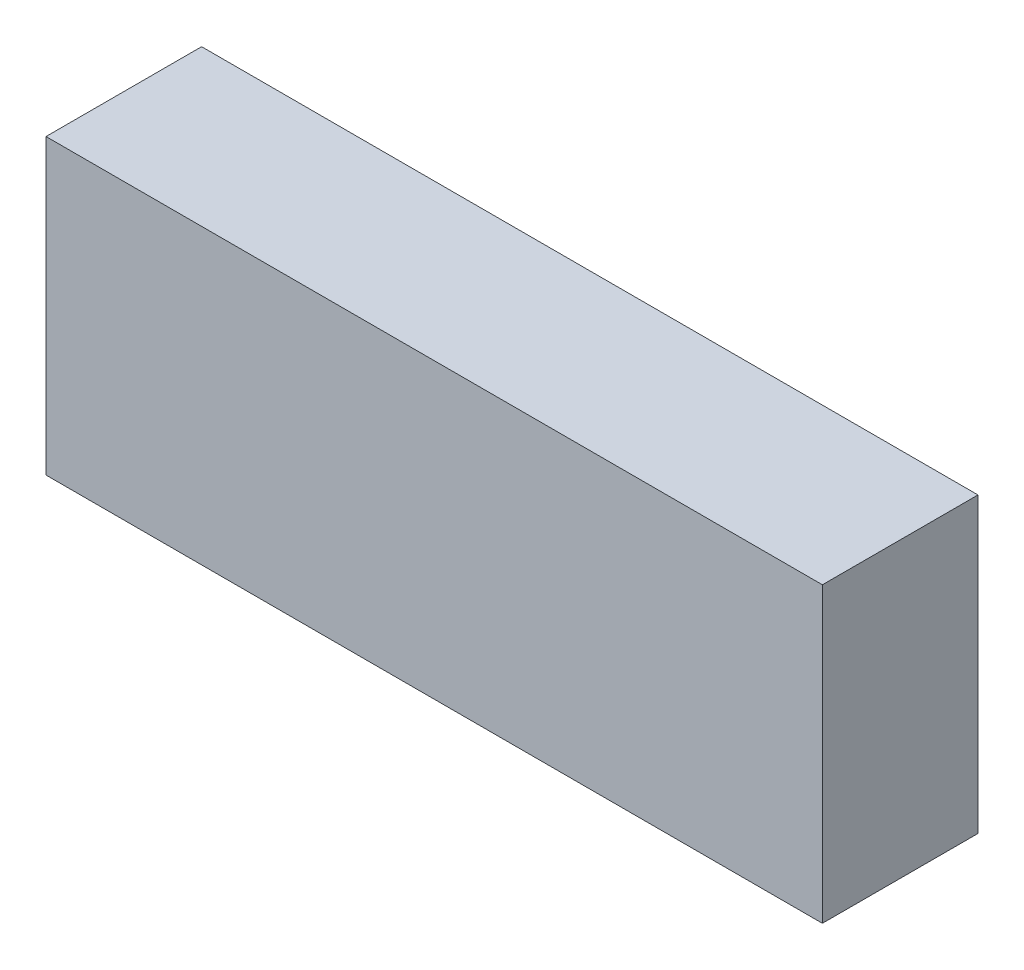
ISO-10303-21;
HEADER;
FILE_DESCRIPTION(('STEP AP214'),'2;1');
FILE_NAME('part.step','',(''),(''),'','','');
FILE_SCHEMA(('AUTOMOTIVE_DESIGN { 1 0 10303 214 1 1 1 1 }'));
ENDSEC;
DATA;
#1=APPLICATION_CONTEXT('core data for automotive mechanical design processes');
#2=APPLICATION_PROTOCOL_DEFINITION('international standard','automotive_design',2000,#1);
#3=PRODUCT_CONTEXT('',#1,'mechanical');
#4=PRODUCT('Part','Part','',(#3));
#5=PRODUCT_RELATED_PRODUCT_CATEGORY('part','',(#4));
#6=PRODUCT_DEFINITION_FORMATION('','',#4);
#7=PRODUCT_DEFINITION_CONTEXT('part definition',#1,'design');
#8=PRODUCT_DEFINITION('design','',#6,#7);
#9=PRODUCT_DEFINITION_SHAPE('','',#8);
#10=(LENGTH_UNIT() NAMED_UNIT(*) SI_UNIT(.MILLI.,.METRE.));
#11=(NAMED_UNIT(*) PLANE_ANGLE_UNIT() SI_UNIT($,.RADIAN.));
#12=(NAMED_UNIT(*) SI_UNIT($,.STERADIAN.) SOLID_ANGLE_UNIT());
#13=UNCERTAINTY_MEASURE_WITH_UNIT(LENGTH_MEASURE(1.E-05),#10,'distance_accuracy_value','');
#14=(GEOMETRIC_REPRESENTATION_CONTEXT(3) GLOBAL_UNCERTAINTY_ASSIGNED_CONTEXT((#13)) GLOBAL_UNIT_ASSIGNED_CONTEXT((#10,
#11,#12)) REPRESENTATION_CONTEXT('',''));
#15=CARTESIAN_POINT('',(0.,0.,0.));
#16=DIRECTION('',(0.,0.,1.));
#17=DIRECTION('',(1.,0.,0.));
#18=AXIS2_PLACEMENT_3D('',#15,#16,#17);
#19=CARTESIAN_POINT('',(0.,0.,9.5));
#20=DIRECTION('',(1.,0.,0.));
#21=DIRECTION('',(0.,0.,-1.));
#22=AXIS2_PLACEMENT_3D('',#19,#20,#21);
#23=PLANE('',#22);
#24=DIRECTION('',(0.,-1.,0.));
#25=VECTOR('',#24,1.);
#26=CARTESIAN_POINT('',(0.,0.,0.));
#27=LINE('',#26,#25);
#28=CARTESIAN_POINT('',(0.,17.9,0.));
#29=VERTEX_POINT('',#28);
#30=CARTESIAN_POINT('',(0.,0.,0.));
#31=VERTEX_POINT('',#30);
#32=EDGE_CURVE('E107',#29,#31,#27,.T.);
#33=ORIENTED_EDGE('',*,*,#32,.T.);
#34=DIRECTION('',(0.,0.,-1.));
#35=VECTOR('',#34,1.);
#36=CARTESIAN_POINT('',(0.,0.,9.5));
#37=LINE('',#36,#35);
#38=CARTESIAN_POINT('',(0.,0.,9.5));
#39=VERTEX_POINT('',#38);
#40=EDGE_CURVE('E11',#39,#31,#37,.T.);
#41=ORIENTED_EDGE('',*,*,#40,.F.);
#42=DIRECTION('',(0.,-1.,0.));
#43=VECTOR('',#42,1.);
#44=CARTESIAN_POINT('',(0.,0.,9.5));
#45=LINE('',#44,#43);
#46=CARTESIAN_POINT('',(0.,17.9,9.5));
#47=VERTEX_POINT('',#46);
#48=EDGE_CURVE('E91',#47,#39,#45,.T.);
#49=ORIENTED_EDGE('',*,*,#48,.F.);
#50=DIRECTION('',(0.,0.,-1.));
#51=VECTOR('',#50,1.);
#52=CARTESIAN_POINT('',(0.,17.9,9.5));
#53=LINE('',#52,#51);
#54=EDGE_CURVE('E103',#47,#29,#53,.T.);
#55=ORIENTED_EDGE('',*,*,#54,.T.);
#56=EDGE_LOOP('',(#33,#41,#49,#55));
#57=FACE_BOUND('',#56,.T.);
#58=ADVANCED_FACE('F39',(#57),#23,.F.);
#59=CARTESIAN_POINT('',(0.,0.,9.5));
#60=DIRECTION('',(0.,1.,0.));
#61=DIRECTION('',(0.,0.,1.));
#62=AXIS2_PLACEMENT_3D('',#59,#60,#61);
#63=PLANE('',#62);
#64=DIRECTION('',(1.,0.,0.));
#65=VECTOR('',#64,1.);
#66=CARTESIAN_POINT('',(0.,0.,0.));
#67=LINE('',#66,#65);
#68=CARTESIAN_POINT('',(47.4000000000001,0.,0.));
#69=VERTEX_POINT('',#68);
#70=EDGE_CURVE('E96',#31,#69,#67,.T.);
#71=ORIENTED_EDGE('',*,*,#70,.T.);
#72=DIRECTION('',(0.,0.,-1.));
#73=VECTOR('',#72,1.);
#74=CARTESIAN_POINT('',(47.4000000000001,0.,9.5));
#75=LINE('',#74,#73);
#76=CARTESIAN_POINT('',(47.4000000000001,0.,9.5));
#77=VERTEX_POINT('',#76);
#78=EDGE_CURVE('E48',#77,#69,#75,.T.);
#79=ORIENTED_EDGE('',*,*,#78,.F.);
#80=DIRECTION('',(1.,0.,0.));
#81=VECTOR('',#80,1.);
#82=CARTESIAN_POINT('',(0.,0.,9.5));
#83=LINE('',#82,#81);
#84=EDGE_CURVE('E86',#39,#77,#83,.T.);
#85=ORIENTED_EDGE('',*,*,#84,.F.);
#86=ORIENTED_EDGE('',*,*,#40,.T.);
#87=EDGE_LOOP('',(#71,#79,#85,#86));
#88=FACE_BOUND('',#87,.T.);
#89=ADVANCED_FACE('F95',(#88),#63,.F.);
#90=CARTESIAN_POINT('',(47.4000000000001,0.,9.5));
#91=DIRECTION('',(-1.,0.,0.));
#92=DIRECTION('',(0.,0.,1.));
#93=AXIS2_PLACEMENT_3D('',#90,#91,#92);
#94=PLANE('',#93);
#95=DIRECTION('',(0.,1.,0.));
#96=VECTOR('',#95,1.);
#97=CARTESIAN_POINT('',(47.4000000000001,0.,0.));
#98=LINE('',#97,#96);
#99=CARTESIAN_POINT('',(47.4000000000001,17.9,0.));
#100=VERTEX_POINT('',#99);
#101=EDGE_CURVE('E73',#69,#100,#98,.T.);
#102=ORIENTED_EDGE('',*,*,#101,.T.);
#103=DIRECTION('',(0.,0.,-1.));
#104=VECTOR('',#103,1.);
#105=CARTESIAN_POINT('',(47.4000000000001,17.9,9.5));
#106=LINE('',#105,#104);
#107=CARTESIAN_POINT('',(47.4000000000001,17.9,9.5));
#108=VERTEX_POINT('',#107);
#109=EDGE_CURVE('E98',#108,#100,#106,.T.);
#110=ORIENTED_EDGE('',*,*,#109,.F.);
#111=DIRECTION('',(0.,1.,0.));
#112=VECTOR('',#111,1.);
#113=CARTESIAN_POINT('',(47.4000000000001,0.,9.5));
#114=LINE('',#113,#112);
#115=EDGE_CURVE('E89',#77,#108,#114,.T.);
#116=ORIENTED_EDGE('',*,*,#115,.F.);
#117=ORIENTED_EDGE('',*,*,#78,.T.);
#118=EDGE_LOOP('',(#102,#110,#116,#117));
#119=FACE_BOUND('',#118,.T.);
#120=ADVANCED_FACE('F99',(#119),#94,.F.);
#121=CARTESIAN_POINT('',(0.,17.9,9.5));
#122=DIRECTION('',(0.,-1.,0.));
#123=DIRECTION('',(0.,0.,-1.));
#124=AXIS2_PLACEMENT_3D('',#121,#122,#123);
#125=PLANE('',#124);
#126=DIRECTION('',(-1.,0.,0.));
#127=VECTOR('',#126,1.);
#128=CARTESIAN_POINT('',(0.,17.9,0.));
#129=LINE('',#128,#127);
#130=EDGE_CURVE('E79',#100,#29,#129,.T.);
#131=ORIENTED_EDGE('',*,*,#130,.T.);
#132=ORIENTED_EDGE('',*,*,#54,.F.);
#133=DIRECTION('',(-1.,0.,0.));
#134=VECTOR('',#133,1.);
#135=CARTESIAN_POINT('',(0.,17.9,9.5));
#136=LINE('',#135,#134);
#137=EDGE_CURVE('E56',#108,#47,#136,.T.);
#138=ORIENTED_EDGE('',*,*,#137,.F.);
#139=ORIENTED_EDGE('',*,*,#109,.T.);
#140=EDGE_LOOP('',(#131,#132,#138,#139));
#141=FACE_BOUND('',#140,.T.);
#142=ADVANCED_FACE('F120',(#141),#125,.F.);
#143=CARTESIAN_POINT('',(0.,0.,9.5));
#144=DIRECTION('',(0.,0.,-1.));
#145=DIRECTION('',(-1.,0.,0.));
#146=AXIS2_PLACEMENT_3D('',#143,#144,#145);
#147=PLANE('',#146);
#148=ORIENTED_EDGE('',*,*,#48,.T.);
#149=ORIENTED_EDGE('',*,*,#84,.T.);
#150=ORIENTED_EDGE('',*,*,#115,.T.);
#151=ORIENTED_EDGE('',*,*,#137,.T.);
#152=EDGE_LOOP('',(#148,#149,#150,#151));
#153=FACE_BOUND('',#152,.T.);
#154=ADVANCED_FACE('F87',(#153),#147,.F.);
#155=CARTESIAN_POINT('',(0.,0.,0.));
#156=DIRECTION('',(0.,0.,-1.));
#157=DIRECTION('',(-1.,0.,0.));
#158=AXIS2_PLACEMENT_3D('',#155,#156,#157);
#159=PLANE('',#158);
#160=ORIENTED_EDGE('',*,*,#32,.F.);
#161=ORIENTED_EDGE('',*,*,#130,.F.);
#162=ORIENTED_EDGE('',*,*,#101,.F.);
#163=ORIENTED_EDGE('',*,*,#70,.F.);
#164=EDGE_LOOP('',(#160,#161,#162,#163));
#165=FACE_BOUND('',#164,.T.);
#166=ADVANCED_FACE('F123',(#165),#159,.T.);
#167=CLOSED_SHELL('',(#58,#89,#120,#142,#154,#166));
#168=MANIFOLD_SOLID_BREP('B2',#167);
#169=ADVANCED_BREP_SHAPE_REPRESENTATION('',(#18,#168),#14);
#170=SHAPE_DEFINITION_REPRESENTATION(#9,#169);
ENDSEC;
END-ISO-10303-21;
